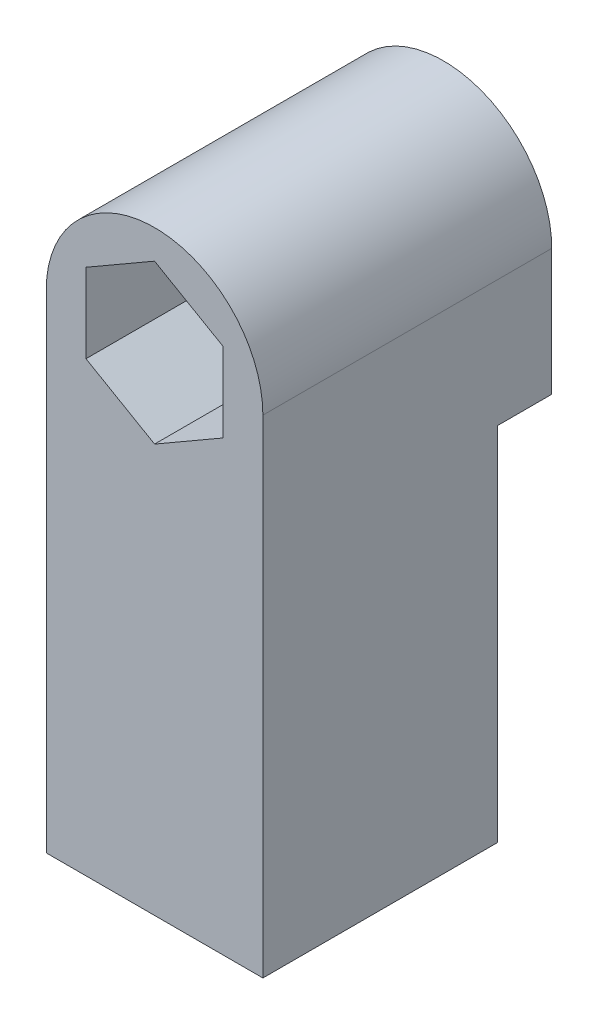
ISO-10303-21;
HEADER;
FILE_DESCRIPTION(('STEP AP214'),'2;1');
FILE_NAME('part.step','',(''),(''),'','','');
FILE_SCHEMA(('AUTOMOTIVE_DESIGN { 1 0 10303 214 1 1 1 1 }'));
ENDSEC;
DATA;
#1=APPLICATION_CONTEXT('core data for automotive mechanical design processes');
#2=APPLICATION_PROTOCOL_DEFINITION('international standard','automotive_design',2000,#1);
#3=PRODUCT_CONTEXT('',#1,'mechanical');
#4=PRODUCT('Part','Part','',(#3));
#5=PRODUCT_RELATED_PRODUCT_CATEGORY('part','',(#4));
#6=PRODUCT_DEFINITION_FORMATION('','',#4);
#7=PRODUCT_DEFINITION_CONTEXT('part definition',#1,'design');
#8=PRODUCT_DEFINITION('design','',#6,#7);
#9=PRODUCT_DEFINITION_SHAPE('','',#8);
#10=(LENGTH_UNIT() NAMED_UNIT(*) SI_UNIT(.MILLI.,.METRE.));
#11=(NAMED_UNIT(*) PLANE_ANGLE_UNIT() SI_UNIT($,.RADIAN.));
#12=(NAMED_UNIT(*) SI_UNIT($,.STERADIAN.) SOLID_ANGLE_UNIT());
#13=UNCERTAINTY_MEASURE_WITH_UNIT(LENGTH_MEASURE(1.E-05),#10,'distance_accuracy_value','');
#14=(GEOMETRIC_REPRESENTATION_CONTEXT(3) GLOBAL_UNCERTAINTY_ASSIGNED_CONTEXT((#13)) GLOBAL_UNIT_ASSIGNED_CONTEXT((#10,
#11,#12)) REPRESENTATION_CONTEXT('',''));
#15=CARTESIAN_POINT('',(0.,0.,0.));
#16=DIRECTION('',(0.,0.,1.));
#17=DIRECTION('',(1.,0.,0.));
#18=AXIS2_PLACEMENT_3D('',#15,#16,#17);
#19=CARTESIAN_POINT('',(0.,0.,16.));
#20=DIRECTION('',(0.,0.,-1.));
#21=DIRECTION('',(-1.,0.,0.));
#22=AXIS2_PLACEMENT_3D('',#19,#20,#21);
#23=CYLINDRICAL_SURFACE('',#22,6.);
#24=CARTESIAN_POINT('',(0.,0.,0.));
#25=DIRECTION('',(0.,0.,1.));
#26=DIRECTION('',(1.,0.,0.));
#27=AXIS2_PLACEMENT_3D('',#24,#25,#26);
#28=CIRCLE('',#27,6.);
#29=CARTESIAN_POINT('',(6.,0.,0.));
#30=VERTEX_POINT('',#29);
#31=CARTESIAN_POINT('',(-6.,0.,0.));
#32=VERTEX_POINT('',#31);
#33=EDGE_CURVE('E219',#30,#32,#28,.T.);
#34=ORIENTED_EDGE('',*,*,#33,.T.);
#35=DIRECTION('',(0.,0.,-1.));
#36=VECTOR('',#35,1.);
#37=CARTESIAN_POINT('',(-6.,0.,16.));
#38=LINE('',#37,#36);
#39=CARTESIAN_POINT('',(-6.,0.,16.));
#40=VERTEX_POINT('',#39);
#41=EDGE_CURVE('E11',#40,#32,#38,.T.);
#42=ORIENTED_EDGE('',*,*,#41,.F.);
#43=CARTESIAN_POINT('',(0.,0.,16.));
#44=DIRECTION('',(0.,0.,1.));
#45=DIRECTION('',(1.,0.,0.));
#46=AXIS2_PLACEMENT_3D('',#43,#44,#45);
#47=CIRCLE('',#46,6.);
#48=CARTESIAN_POINT('',(6.,0.,16.));
#49=VERTEX_POINT('',#48);
#50=EDGE_CURVE('E234',#49,#40,#47,.T.);
#51=ORIENTED_EDGE('',*,*,#50,.F.);
#52=DIRECTION('',(0.,0.,-1.));
#53=VECTOR('',#52,1.);
#54=CARTESIAN_POINT('',(6.,0.,16.));
#55=LINE('',#54,#53);
#56=EDGE_CURVE('E248',#49,#30,#55,.T.);
#57=ORIENTED_EDGE('',*,*,#56,.T.);
#58=EDGE_LOOP('',(#34,#42,#51,#57));
#59=FACE_BOUND('',#58,.T.);
#60=ADVANCED_FACE('F43',(#59),#23,.T.);
#61=CARTESIAN_POINT('',(-6.,0.,16.));
#62=DIRECTION('',(1.,0.,0.));
#63=DIRECTION('',(0.,1.,0.));
#64=AXIS2_PLACEMENT_3D('',#61,#62,#63);
#65=PLANE('',#64);
#66=DIRECTION('',(0.,0.,1.));
#67=VECTOR('',#66,1.);
#68=CARTESIAN_POINT('',(-6.,-7.,0.));
#69=LINE('',#68,#67);
#70=CARTESIAN_POINT('',(-6.,-7.,0.));
#71=VERTEX_POINT('',#70);
#72=CARTESIAN_POINT('',(-6.,-7.,3.));
#73=VERTEX_POINT('',#72);
#74=EDGE_CURVE('E58',#71,#73,#69,.T.);
#75=ORIENTED_EDGE('',*,*,#74,.T.);
#76=DIRECTION('',(0.,-1.,0.));
#77=VECTOR('',#76,1.);
#78=CARTESIAN_POINT('',(-6.,-7.,3.));
#79=LINE('',#78,#77);
#80=CARTESIAN_POINT('',(-6.00000000000001,-27.,3.));
#81=VERTEX_POINT('',#80);
#82=EDGE_CURVE('E142',#73,#81,#79,.T.);
#83=ORIENTED_EDGE('',*,*,#82,.T.);
#84=DIRECTION('',(0.,0.,-1.));
#85=VECTOR('',#84,1.);
#86=CARTESIAN_POINT('',(-6.,-27.,16.));
#87=LINE('',#86,#85);
#88=CARTESIAN_POINT('',(-6.,-27.,16.));
#89=VERTEX_POINT('',#88);
#90=EDGE_CURVE('E51',#89,#81,#87,.T.);
#91=ORIENTED_EDGE('',*,*,#90,.F.);
#92=DIRECTION('',(0.,-1.,0.));
#93=VECTOR('',#92,1.);
#94=CARTESIAN_POINT('',(-6.,0.,16.));
#95=LINE('',#94,#93);
#96=EDGE_CURVE('E238',#40,#89,#95,.T.);
#97=ORIENTED_EDGE('',*,*,#96,.F.);
#98=ORIENTED_EDGE('',*,*,#41,.T.);
#99=DIRECTION('',(0.,-1.,0.));
#100=VECTOR('',#99,1.);
#101=CARTESIAN_POINT('',(-6.,0.,0.));
#102=LINE('',#101,#100);
#103=EDGE_CURVE('E152',#32,#71,#102,.T.);
#104=ORIENTED_EDGE('',*,*,#103,.T.);
#105=EDGE_LOOP('',(#75,#83,#91,#97,#98,#104));
#106=FACE_BOUND('',#105,.T.);
#107=ADVANCED_FACE('F151',(#106),#65,.F.);
#108=CARTESIAN_POINT('',(-6.,-27.,16.));
#109=DIRECTION('',(0.,1.,0.));
#110=DIRECTION('',(0.,0.,1.));
#111=AXIS2_PLACEMENT_3D('',#108,#109,#110);
#112=PLANE('',#111);
#113=CARTESIAN_POINT('',(0.,-27.,13.5));
#114=DIRECTION('',(0.,-1.,0.));
#115=DIRECTION('',(0.,0.,-1.));
#116=AXIS2_PLACEMENT_3D('',#113,#114,#115);
#117=CIRCLE('',#116,1.);
#118=CARTESIAN_POINT('',(0.,-27.,12.5));
#119=VERTEX_POINT('',#118);
#120=EDGE_CURVE('E494',#119,#119,#117,.T.);
#121=ORIENTED_EDGE('',*,*,#120,.F.);
#122=EDGE_LOOP('',(#121));
#123=FACE_BOUND('',#122,.T.);
#124=CARTESIAN_POINT('',(0.,-27.,5.5));
#125=DIRECTION('',(0.,-1.,0.));
#126=DIRECTION('',(0.,0.,-1.));
#127=AXIS2_PLACEMENT_3D('',#124,#125,#126);
#128=CIRCLE('',#127,1.);
#129=CARTESIAN_POINT('',(0.,-27.,4.5));
#130=VERTEX_POINT('',#129);
#131=EDGE_CURVE('E498',#130,#130,#128,.T.);
#132=ORIENTED_EDGE('',*,*,#131,.F.);
#133=EDGE_LOOP('',(#132));
#134=FACE_BOUND('',#133,.T.);
#135=ORIENTED_EDGE('',*,*,#90,.T.);
#136=DIRECTION('',(1.,0.,0.));
#137=VECTOR('',#136,1.);
#138=CARTESIAN_POINT('',(-6.00000000000001,-27.,3.));
#139=LINE('',#138,#137);
#140=CARTESIAN_POINT('',(6.,-27.,3.));
#141=VERTEX_POINT('',#140);
#142=EDGE_CURVE('E138',#81,#141,#139,.T.);
#143=ORIENTED_EDGE('',*,*,#142,.T.);
#144=DIRECTION('',(0.,0.,-1.));
#145=VECTOR('',#144,1.);
#146=CARTESIAN_POINT('',(6.,-27.,16.));
#147=LINE('',#146,#145);
#148=CARTESIAN_POINT('',(6.,-27.,16.));
#149=VERTEX_POINT('',#148);
#150=EDGE_CURVE('E259',#149,#141,#147,.T.);
#151=ORIENTED_EDGE('',*,*,#150,.F.);
#152=DIRECTION('',(1.,0.,0.));
#153=VECTOR('',#152,1.);
#154=CARTESIAN_POINT('',(-6.,-27.,16.));
#155=LINE('',#154,#153);
#156=EDGE_CURVE('E242',#89,#149,#155,.T.);
#157=ORIENTED_EDGE('',*,*,#156,.F.);
#158=EDGE_LOOP('',(#135,#143,#151,#157));
#159=FACE_BOUND('',#158,.T.);
#160=ADVANCED_FACE('F265',(#123,#134,#159),#112,.F.);
#161=CARTESIAN_POINT('',(6.,-27.,16.));
#162=DIRECTION('',(-1.,0.,0.));
#163=DIRECTION('',(0.,-1.,0.));
#164=AXIS2_PLACEMENT_3D('',#161,#162,#163);
#165=PLANE('',#164);
#166=ORIENTED_EDGE('',*,*,#150,.T.);
#167=DIRECTION('',(0.,-1.,0.));
#168=VECTOR('',#167,1.);
#169=CARTESIAN_POINT('',(6.,-7.,3.));
#170=LINE('',#169,#168);
#171=CARTESIAN_POINT('',(6.,-7.,3.));
#172=VERTEX_POINT('',#171);
#173=EDGE_CURVE('E154',#172,#141,#170,.T.);
#174=ORIENTED_EDGE('',*,*,#173,.F.);
#175=DIRECTION('',(0.,0.,1.));
#176=VECTOR('',#175,1.);
#177=CARTESIAN_POINT('',(6.,-7.,0.));
#178=LINE('',#177,#176);
#179=CARTESIAN_POINT('',(6.,-7.,0.));
#180=VERTEX_POINT('',#179);
#181=EDGE_CURVE('E134',#180,#172,#178,.T.);
#182=ORIENTED_EDGE('',*,*,#181,.F.);
#183=DIRECTION('',(0.,1.,0.));
#184=VECTOR('',#183,1.);
#185=CARTESIAN_POINT('',(6.,-27.,0.));
#186=LINE('',#185,#184);
#187=EDGE_CURVE('E239',#180,#30,#186,.T.);
#188=ORIENTED_EDGE('',*,*,#187,.T.);
#189=ORIENTED_EDGE('',*,*,#56,.F.);
#190=DIRECTION('',(0.,1.,0.));
#191=VECTOR('',#190,1.);
#192=CARTESIAN_POINT('',(6.,-27.,16.));
#193=LINE('',#192,#191);
#194=EDGE_CURVE('E245',#149,#49,#193,.T.);
#195=ORIENTED_EDGE('',*,*,#194,.F.);
#196=EDGE_LOOP('',(#166,#174,#182,#188,#189,#195));
#197=FACE_BOUND('',#196,.T.);
#198=ADVANCED_FACE('F279',(#197),#165,.F.);
#199=CARTESIAN_POINT('',(0.,0.,16.));
#200=DIRECTION('',(0.,0.,1.));
#201=DIRECTION('',(1.,0.,0.));
#202=AXIS2_PLACEMENT_3D('',#199,#200,#201);
#203=PLANE('',#202);
#204=DIRECTION('',(-0.866025403784439,0.5,0.));
#205=VECTOR('',#204,1.);
#206=CARTESIAN_POINT('',(3.8,2.19393102292058,16.));
#207=LINE('',#206,#205);
#208=CARTESIAN_POINT('',(3.8,2.19393102292058,16.));
#209=VERTEX_POINT('',#208);
#210=CARTESIAN_POINT('',(0.,4.38786204584116,16.));
#211=VERTEX_POINT('',#210);
#212=EDGE_CURVE('E66',#209,#211,#207,.T.);
#213=ORIENTED_EDGE('',*,*,#212,.F.);
#214=DIRECTION('',(0.,1.,0.));
#215=VECTOR('',#214,1.);
#216=CARTESIAN_POINT('',(3.8,-2.19393102292058,16.));
#217=LINE('',#216,#215);
#218=CARTESIAN_POINT('',(3.8,-2.19393102292058,16.));
#219=VERTEX_POINT('',#218);
#220=EDGE_CURVE('E174',#219,#209,#217,.T.);
#221=ORIENTED_EDGE('',*,*,#220,.F.);
#222=DIRECTION('',(0.866025403784438,0.5,0.));
#223=VECTOR('',#222,1.);
#224=CARTESIAN_POINT('',(0.,-4.38786204584116,16.));
#225=LINE('',#224,#223);
#226=CARTESIAN_POINT('',(0.,-4.38786204584116,16.));
#227=VERTEX_POINT('',#226);
#228=EDGE_CURVE('E209',#227,#219,#225,.T.);
#229=ORIENTED_EDGE('',*,*,#228,.F.);
#230=DIRECTION('',(0.866025403784439,-0.5,0.));
#231=VECTOR('',#230,1.);
#232=CARTESIAN_POINT('',(-3.8,-2.19393102292058,16.));
#233=LINE('',#232,#231);
#234=CARTESIAN_POINT('',(-3.8,-2.19393102292058,16.));
#235=VERTEX_POINT('',#234);
#236=EDGE_CURVE('E205',#235,#227,#233,.T.);
#237=ORIENTED_EDGE('',*,*,#236,.F.);
#238=DIRECTION('',(0.,-1.,0.));
#239=VECTOR('',#238,1.);
#240=CARTESIAN_POINT('',(-3.8,2.19393102292058,16.));
#241=LINE('',#240,#239);
#242=CARTESIAN_POINT('',(-3.8,2.19393102292058,16.));
#243=VERTEX_POINT('',#242);
#244=EDGE_CURVE('E201',#243,#235,#241,.T.);
#245=ORIENTED_EDGE('',*,*,#244,.F.);
#246=DIRECTION('',(-0.866025403784438,-0.5,0.));
#247=VECTOR('',#246,1.);
#248=CARTESIAN_POINT('',(0.,4.38786204584116,16.));
#249=LINE('',#248,#247);
#250=EDGE_CURVE('E197',#211,#243,#249,.T.);
#251=ORIENTED_EDGE('',*,*,#250,.F.);
#252=EDGE_LOOP('',(#213,#221,#229,#237,#245,#251));
#253=FACE_BOUND('',#252,.T.);
#254=ORIENTED_EDGE('',*,*,#50,.T.);
#255=ORIENTED_EDGE('',*,*,#96,.T.);
#256=ORIENTED_EDGE('',*,*,#156,.T.);
#257=ORIENTED_EDGE('',*,*,#194,.T.);
#258=EDGE_LOOP('',(#254,#255,#256,#257));
#259=FACE_BOUND('',#258,.T.);
#260=ADVANCED_FACE('F270',(#253,#259),#203,.T.);
#261=CARTESIAN_POINT('',(0.,0.,0.));
#262=DIRECTION('',(0.,0.,1.));
#263=DIRECTION('',(1.,0.,0.));
#264=AXIS2_PLACEMENT_3D('',#261,#262,#263);
#265=PLANE('',#264);
#266=DIRECTION('',(0.,1.,0.));
#267=VECTOR('',#266,1.);
#268=CARTESIAN_POINT('',(3.8,-2.19393102292058,0.));
#269=LINE('',#268,#267);
#270=CARTESIAN_POINT('',(3.8,-2.19393102292058,0.));
#271=VERTEX_POINT('',#270);
#272=CARTESIAN_POINT('',(3.8,2.19393102292058,0.));
#273=VERTEX_POINT('',#272);
#274=EDGE_CURVE('E190',#271,#273,#269,.T.);
#275=ORIENTED_EDGE('',*,*,#274,.T.);
#276=DIRECTION('',(-0.866025403784439,0.5,0.));
#277=VECTOR('',#276,1.);
#278=CARTESIAN_POINT('',(3.8,2.19393102292058,0.));
#279=LINE('',#278,#277);
#280=CARTESIAN_POINT('',(0.,4.38786204584116,0.));
#281=VERTEX_POINT('',#280);
#282=EDGE_CURVE('E169',#273,#281,#279,.T.);
#283=ORIENTED_EDGE('',*,*,#282,.T.);
#284=DIRECTION('',(-0.866025403784438,-0.5,0.));
#285=VECTOR('',#284,1.);
#286=CARTESIAN_POINT('',(0.,4.38786204584116,0.));
#287=LINE('',#286,#285);
#288=CARTESIAN_POINT('',(-3.8,2.19393102292058,0.));
#289=VERTEX_POINT('',#288);
#290=EDGE_CURVE('E173',#281,#289,#287,.T.);
#291=ORIENTED_EDGE('',*,*,#290,.T.);
#292=DIRECTION('',(0.,-1.,0.));
#293=VECTOR('',#292,1.);
#294=CARTESIAN_POINT('',(-3.8,2.19393102292058,0.));
#295=LINE('',#294,#293);
#296=CARTESIAN_POINT('',(-3.8,-2.19393102292058,0.));
#297=VERTEX_POINT('',#296);
#298=EDGE_CURVE('E178',#289,#297,#295,.T.);
#299=ORIENTED_EDGE('',*,*,#298,.T.);
#300=DIRECTION('',(0.866025403784439,-0.5,0.));
#301=VECTOR('',#300,1.);
#302=CARTESIAN_POINT('',(-3.8,-2.19393102292058,0.));
#303=LINE('',#302,#301);
#304=CARTESIAN_POINT('',(0.,-4.38786204584116,0.));
#305=VERTEX_POINT('',#304);
#306=EDGE_CURVE('E182',#297,#305,#303,.T.);
#307=ORIENTED_EDGE('',*,*,#306,.T.);
#308=DIRECTION('',(0.866025403784438,0.5,0.));
#309=VECTOR('',#308,1.);
#310=CARTESIAN_POINT('',(0.,-4.38786204584116,0.));
#311=LINE('',#310,#309);
#312=EDGE_CURVE('E186',#305,#271,#311,.T.);
#313=ORIENTED_EDGE('',*,*,#312,.T.);
#314=EDGE_LOOP('',(#275,#283,#291,#299,#307,#313));
#315=FACE_BOUND('',#314,.T.);
#316=ORIENTED_EDGE('',*,*,#187,.F.);
#317=DIRECTION('',(1.,0.,0.));
#318=VECTOR('',#317,1.);
#319=CARTESIAN_POINT('',(-6.,-7.,0.));
#320=LINE('',#319,#318);
#321=EDGE_CURVE('E139',#71,#180,#320,.T.);
#322=ORIENTED_EDGE('',*,*,#321,.F.);
#323=ORIENTED_EDGE('',*,*,#103,.F.);
#324=ORIENTED_EDGE('',*,*,#33,.F.);
#325=EDGE_LOOP('',(#316,#322,#323,#324));
#326=FACE_BOUND('',#325,.T.);
#327=ADVANCED_FACE('F277',(#315,#326),#265,.F.);
#328=CARTESIAN_POINT('',(3.8,2.19393102292058,0.));
#329=DIRECTION('',(0.5,0.866025403784439,0.));
#330=DIRECTION('',(-0.866025403784439,0.5,0.));
#331=AXIS2_PLACEMENT_3D('',#328,#329,#330);
#332=PLANE('',#331);
#333=ORIENTED_EDGE('',*,*,#212,.T.);
#334=DIRECTION('',(0.,0.,1.));
#335=VECTOR('',#334,1.);
#336=CARTESIAN_POINT('',(0.,4.38786204584116,0.));
#337=LINE('',#336,#335);
#338=EDGE_CURVE('E194',#281,#211,#337,.T.);
#339=ORIENTED_EDGE('',*,*,#338,.F.);
#340=ORIENTED_EDGE('',*,*,#282,.F.);
#341=DIRECTION('',(0.,0.,1.));
#342=VECTOR('',#341,1.);
#343=CARTESIAN_POINT('',(3.8,2.19393102292058,0.));
#344=LINE('',#343,#342);
#345=EDGE_CURVE('E216',#273,#209,#344,.T.);
#346=ORIENTED_EDGE('',*,*,#345,.T.);
#347=EDGE_LOOP('',(#333,#339,#340,#346));
#348=FACE_BOUND('',#347,.T.);
#349=ADVANCED_FACE('F418',(#348),#332,.F.);
#350=CARTESIAN_POINT('',(3.8,-2.19393102292058,0.));
#351=DIRECTION('',(1.,0.,0.));
#352=DIRECTION('',(0.,1.,0.));
#353=AXIS2_PLACEMENT_3D('',#350,#351,#352);
#354=PLANE('',#353);
#355=ORIENTED_EDGE('',*,*,#220,.T.);
#356=ORIENTED_EDGE('',*,*,#345,.F.);
#357=ORIENTED_EDGE('',*,*,#274,.F.);
#358=DIRECTION('',(0.,0.,1.));
#359=VECTOR('',#358,1.);
#360=CARTESIAN_POINT('',(3.8,-2.19393102292058,0.));
#361=LINE('',#360,#359);
#362=EDGE_CURVE('E220',#271,#219,#361,.T.);
#363=ORIENTED_EDGE('',*,*,#362,.T.);
#364=EDGE_LOOP('',(#355,#356,#357,#363));
#365=FACE_BOUND('',#364,.T.);
#366=ADVANCED_FACE('F408',(#365),#354,.F.);
#367=CARTESIAN_POINT('',(0.,-4.38786204584116,0.));
#368=DIRECTION('',(0.5,-0.866025403784439,0.));
#369=DIRECTION('',(0.866025403784438,0.5,0.));
#370=AXIS2_PLACEMENT_3D('',#367,#368,#369);
#371=PLANE('',#370);
#372=ORIENTED_EDGE('',*,*,#228,.T.);
#373=ORIENTED_EDGE('',*,*,#362,.F.);
#374=ORIENTED_EDGE('',*,*,#312,.F.);
#375=DIRECTION('',(0.,0.,1.));
#376=VECTOR('',#375,1.);
#377=CARTESIAN_POINT('',(0.,-4.38786204584116,0.));
#378=LINE('',#377,#376);
#379=EDGE_CURVE('E223',#305,#227,#378,.T.);
#380=ORIENTED_EDGE('',*,*,#379,.T.);
#381=EDGE_LOOP('',(#372,#373,#374,#380));
#382=FACE_BOUND('',#381,.T.);
#383=ADVANCED_FACE('F398',(#382),#371,.F.);
#384=CARTESIAN_POINT('',(-3.8,-2.19393102292058,0.));
#385=DIRECTION('',(-0.5,-0.866025403784439,0.));
#386=DIRECTION('',(0.866025403784439,-0.5,0.));
#387=AXIS2_PLACEMENT_3D('',#384,#385,#386);
#388=PLANE('',#387);
#389=ORIENTED_EDGE('',*,*,#236,.T.);
#390=ORIENTED_EDGE('',*,*,#379,.F.);
#391=ORIENTED_EDGE('',*,*,#306,.F.);
#392=DIRECTION('',(0.,0.,1.));
#393=VECTOR('',#392,1.);
#394=CARTESIAN_POINT('',(-3.8,-2.19393102292058,0.));
#395=LINE('',#394,#393);
#396=EDGE_CURVE('E226',#297,#235,#395,.T.);
#397=ORIENTED_EDGE('',*,*,#396,.T.);
#398=EDGE_LOOP('',(#389,#390,#391,#397));
#399=FACE_BOUND('',#398,.T.);
#400=ADVANCED_FACE('F388',(#399),#388,.F.);
#401=CARTESIAN_POINT('',(-3.8,2.19393102292058,0.));
#402=DIRECTION('',(-1.,0.,0.));
#403=DIRECTION('',(0.,-1.,0.));
#404=AXIS2_PLACEMENT_3D('',#401,#402,#403);
#405=PLANE('',#404);
#406=ORIENTED_EDGE('',*,*,#244,.T.);
#407=ORIENTED_EDGE('',*,*,#396,.F.);
#408=ORIENTED_EDGE('',*,*,#298,.F.);
#409=DIRECTION('',(0.,0.,1.));
#410=VECTOR('',#409,1.);
#411=CARTESIAN_POINT('',(-3.8,2.19393102292058,0.));
#412=LINE('',#411,#410);
#413=EDGE_CURVE('E229',#289,#243,#412,.T.);
#414=ORIENTED_EDGE('',*,*,#413,.T.);
#415=EDGE_LOOP('',(#406,#407,#408,#414));
#416=FACE_BOUND('',#415,.T.);
#417=ADVANCED_FACE('F379',(#416),#405,.F.);
#418=CARTESIAN_POINT('',(0.,4.38786204584116,0.));
#419=DIRECTION('',(-0.5,0.866025403784439,0.));
#420=DIRECTION('',(-0.866025403784438,-0.5,0.));
#421=AXIS2_PLACEMENT_3D('',#418,#419,#420);
#422=PLANE('',#421);
#423=ORIENTED_EDGE('',*,*,#250,.T.);
#424=ORIENTED_EDGE('',*,*,#413,.F.);
#425=ORIENTED_EDGE('',*,*,#290,.F.);
#426=ORIENTED_EDGE('',*,*,#338,.T.);
#427=EDGE_LOOP('',(#423,#424,#425,#426));
#428=FACE_BOUND('',#427,.T.);
#429=ADVANCED_FACE('F371',(#428),#422,.F.);
#430=CARTESIAN_POINT('',(-6.,-7.,3.));
#431=DIRECTION('',(0.,0.,1.));
#432=DIRECTION('',(0.,-1.,0.));
#433=AXIS2_PLACEMENT_3D('',#430,#431,#432);
#434=PLANE('',#433);
#435=ORIENTED_EDGE('',*,*,#173,.T.);
#436=ORIENTED_EDGE('',*,*,#142,.F.);
#437=ORIENTED_EDGE('',*,*,#82,.F.);
#438=DIRECTION('',(1.,0.,0.));
#439=VECTOR('',#438,1.);
#440=CARTESIAN_POINT('',(-6.,-7.,3.));
#441=LINE('',#440,#439);
#442=EDGE_CURVE('E130',#73,#172,#441,.T.);
#443=ORIENTED_EDGE('',*,*,#442,.T.);
#444=EDGE_LOOP('',(#435,#436,#437,#443));
#445=FACE_BOUND('',#444,.T.);
#446=ADVANCED_FACE('F143',(#445),#434,.F.);
#447=CARTESIAN_POINT('',(-6.,-7.,0.));
#448=DIRECTION('',(0.,1.,0.));
#449=DIRECTION('',(0.,0.,1.));
#450=AXIS2_PLACEMENT_3D('',#447,#448,#449);
#451=PLANE('',#450);
#452=ORIENTED_EDGE('',*,*,#181,.T.);
#453=ORIENTED_EDGE('',*,*,#442,.F.);
#454=ORIENTED_EDGE('',*,*,#74,.F.);
#455=ORIENTED_EDGE('',*,*,#321,.T.);
#456=EDGE_LOOP('',(#452,#453,#454,#455));
#457=FACE_BOUND('',#456,.T.);
#458=ADVANCED_FACE('F132',(#457),#451,.F.);
#459=CARTESIAN_POINT('',(0.,-22.,5.5));
#460=DIRECTION('',(0.,-1.,0.));
#461=DIRECTION('',(0.,0.,-1.));
#462=AXIS2_PLACEMENT_3D('',#459,#460,#461);
#463=CYLINDRICAL_SURFACE('',#462,1.);
#464=CARTESIAN_POINT('',(0.,-22.,5.5));
#465=DIRECTION('',(0.,-1.,0.));
#466=DIRECTION('',(0.,0.,-1.));
#467=AXIS2_PLACEMENT_3D('',#464,#465,#466);
#468=CIRCLE('',#467,1.);
#469=CARTESIAN_POINT('',(0.,-22.,4.5));
#470=VERTEX_POINT('',#469);
#471=EDGE_CURVE('E159',#470,#470,#468,.T.);
#472=ORIENTED_EDGE('',*,*,#471,.F.);
#473=EDGE_LOOP('',(#472));
#474=FACE_BOUND('',#473,.T.);
#475=ORIENTED_EDGE('',*,*,#131,.T.);
#476=EDGE_LOOP('',(#475));
#477=FACE_BOUND('',#476,.T.);
#478=ADVANCED_FACE('F314',(#474,#477),#463,.F.);
#479=CARTESIAN_POINT('',(0.,-22.,5.5));
#480=DIRECTION('',(0.,-1.,0.));
#481=DIRECTION('',(0.,0.,-1.));
#482=AXIS2_PLACEMENT_3D('',#479,#480,#481);
#483=PLANE('',#482);
#484=ORIENTED_EDGE('',*,*,#471,.T.);
#485=EDGE_LOOP('',(#484));
#486=FACE_BOUND('',#485,.T.);
#487=ADVANCED_FACE('F319',(#486),#483,.T.);
#488=CARTESIAN_POINT('',(0.,-22.,13.5));
#489=DIRECTION('',(0.,-1.,0.));
#490=DIRECTION('',(0.,0.,-1.));
#491=AXIS2_PLACEMENT_3D('',#488,#489,#490);
#492=CYLINDRICAL_SURFACE('',#491,1.);
#493=CARTESIAN_POINT('',(0.,-22.,13.5));
#494=DIRECTION('',(0.,-1.,0.));
#495=DIRECTION('',(0.,0.,-1.));
#496=AXIS2_PLACEMENT_3D('',#493,#494,#495);
#497=CIRCLE('',#496,1.);
#498=CARTESIAN_POINT('',(0.,-22.,12.5));
#499=VERTEX_POINT('',#498);
#500=EDGE_CURVE('E163',#499,#499,#497,.T.);
#501=ORIENTED_EDGE('',*,*,#500,.F.);
#502=EDGE_LOOP('',(#501));
#503=FACE_BOUND('',#502,.T.);
#504=ORIENTED_EDGE('',*,*,#120,.T.);
#505=EDGE_LOOP('',(#504));
#506=FACE_BOUND('',#505,.T.);
#507=ADVANCED_FACE('F330',(#503,#506),#492,.F.);
#508=CARTESIAN_POINT('',(0.,-22.,13.5));
#509=DIRECTION('',(0.,-1.,0.));
#510=DIRECTION('',(0.,0.,-1.));
#511=AXIS2_PLACEMENT_3D('',#508,#509,#510);
#512=PLANE('',#511);
#513=ORIENTED_EDGE('',*,*,#500,.T.);
#514=EDGE_LOOP('',(#513));
#515=FACE_BOUND('',#514,.T.);
#516=ADVANCED_FACE('F341',(#515),#512,.T.);
#517=CLOSED_SHELL('',(#60,#107,#160,#198,#260,#327,#349,#366,#383,#400,#417,#429,#446,#458,#478,
#487,#507,#516));
#518=MANIFOLD_SOLID_BREP('B2',#517);
#519=ADVANCED_BREP_SHAPE_REPRESENTATION('',(#18,#518),#14);
#520=SHAPE_DEFINITION_REPRESENTATION(#9,#519);
ENDSEC;
END-ISO-10303-21;
